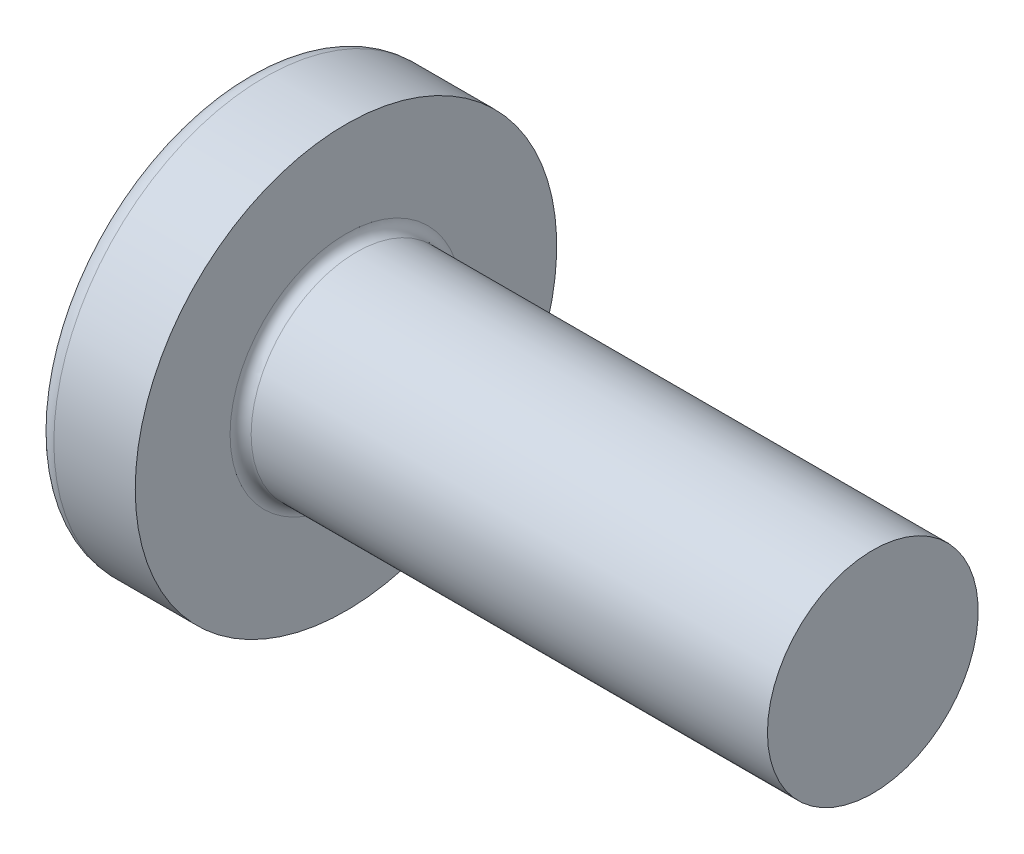
ISO-10303-21;
HEADER;
FILE_DESCRIPTION(('STEP AP214'),'2;1');
FILE_NAME('part.step','',(''),(''),'','','');
FILE_SCHEMA(('AUTOMOTIVE_DESIGN { 1 0 10303 214 1 1 1 1 }'));
ENDSEC;
DATA;
#1=APPLICATION_CONTEXT('core data for automotive mechanical design processes');
#2=APPLICATION_PROTOCOL_DEFINITION('international standard','automotive_design',2000,#1);
#3=PRODUCT_CONTEXT('',#1,'mechanical');
#4=PRODUCT('Part','Part','',(#3));
#5=PRODUCT_RELATED_PRODUCT_CATEGORY('part','',(#4));
#6=PRODUCT_DEFINITION_FORMATION('','',#4);
#7=PRODUCT_DEFINITION_CONTEXT('part definition',#1,'design');
#8=PRODUCT_DEFINITION('design','',#6,#7);
#9=PRODUCT_DEFINITION_SHAPE('','',#8);
#10=(LENGTH_UNIT() NAMED_UNIT(*) SI_UNIT(.MILLI.,.METRE.));
#11=(NAMED_UNIT(*) PLANE_ANGLE_UNIT() SI_UNIT($,.RADIAN.));
#12=(NAMED_UNIT(*) SI_UNIT($,.STERADIAN.) SOLID_ANGLE_UNIT());
#13=UNCERTAINTY_MEASURE_WITH_UNIT(LENGTH_MEASURE(1.E-05),#10,'distance_accuracy_value','');
#14=(GEOMETRIC_REPRESENTATION_CONTEXT(3) GLOBAL_UNCERTAINTY_ASSIGNED_CONTEXT((#13)) GLOBAL_UNIT_ASSIGNED_CONTEXT((#10,
#11,#12)) REPRESENTATION_CONTEXT('',''));
#15=CARTESIAN_POINT('',(0.,0.,0.));
#16=DIRECTION('',(0.,0.,1.));
#17=DIRECTION('',(1.,0.,0.));
#18=AXIS2_PLACEMENT_3D('',#15,#16,#17);
#19=CARTESIAN_POINT('',(6.5,0.,0.));
#20=DIRECTION('',(-1.,0.,0.));
#21=DIRECTION('',(0.,1.,0.));
#22=AXIS2_PLACEMENT_3D('',#19,#20,#21);
#23=SPHERICAL_SURFACE('',#22,6.5);
#24=CARTESIAN_POINT('',(1.26538895452803,0.,0.));
#25=DIRECTION('',(-1.,0.,0.));
#26=DIRECTION('',(0.,0.,1.));
#27=AXIS2_PLACEMENT_3D('',#24,#25,#26);
#28=CIRCLE('',#27,3.85342019543974);
#29=CARTESIAN_POINT('',(1.26538895452803,0.,3.85342019543974));
#30=VERTEX_POINT('',#29);
#31=EDGE_CURVE('E218',#30,#30,#28,.T.);
#32=ORIENTED_EDGE('',*,*,#31,.T.);
#33=EDGE_LOOP('',(#32));
#34=FACE_BOUND('',#33,.T.);
#35=CARTESIAN_POINT('',(0.0788099820016241,0.,0.));
#36=DIRECTION('',(1.,0.,0.));
#37=DIRECTION('',(0.,0.,-1.));
#38=AXIS2_PLACEMENT_3D('',#35,#36,#37);
#39=CIRCLE('',#38,1.0091178091571);
#40=CARTESIAN_POINT('',(0.0788099820016244,-0.514999999999996,-0.867809744562728));
#41=VERTEX_POINT('',#40);
#42=CARTESIAN_POINT('',(0.0788099820016241,-0.867809744562729,-0.515));
#43=VERTEX_POINT('',#42);
#44=EDGE_CURVE('E345',#41,#43,#39,.F.);
#45=ORIENTED_EDGE('',*,*,#44,.F.);
#46=CARTESIAN_POINT('',(6.5,-0.515000000000001,0.));
#47=DIRECTION('',(0.,1.,0.));
#48=DIRECTION('',(0.,0.,1.));
#49=AXIS2_PLACEMENT_3D('',#46,#47,#48);
#50=CIRCLE('',#49,6.47956595768575);
#51=CARTESIAN_POINT('',(0.331830520157854,-0.514999999999992,-1.98455543332603));
#52=VERTEX_POINT('',#51);
#53=EDGE_CURVE('E278',#52,#41,#50,.T.);
#54=ORIENTED_EDGE('',*,*,#53,.F.);
#55=CARTESIAN_POINT('',(6.06443225879603,0.,0.873613881878153));
#56=DIRECTION('',(0.446197753347436,0.,-0.894934391398443));
#57=DIRECTION('',(-0.894934391398442,0.,-0.446197753347436));
#58=AXIS2_PLACEMENT_3D('',#55,#56,#57);
#59=CIRCLE('',#58,6.42628038045433);
#60=CARTESIAN_POINT('',(0.331830520157856,0.515000000000007,-1.98455543332603));
#61=VERTEX_POINT('',#60);
#62=EDGE_CURVE('E252',#52,#61,#59,.T.);
#63=ORIENTED_EDGE('',*,*,#62,.T.);
#64=CARTESIAN_POINT('',(6.5,0.515,0.));
#65=DIRECTION('',(0.,-1.,0.));
#66=DIRECTION('',(0.,0.,-1.));
#67=AXIS2_PLACEMENT_3D('',#64,#65,#66);
#68=CIRCLE('',#67,6.47956595768574);
#69=CARTESIAN_POINT('',(0.0788099820016249,0.515000000000003,-0.867809744562724));
#70=VERTEX_POINT('',#69);
#71=EDGE_CURVE('E307',#70,#61,#68,.T.);
#72=ORIENTED_EDGE('',*,*,#71,.F.);
#73=CARTESIAN_POINT('',(0.0788099820016241,0.867809744562719,-0.515));
#74=VERTEX_POINT('',#73);
#75=EDGE_CURVE('E360',#74,#70,#39,.F.);
#76=ORIENTED_EDGE('',*,*,#75,.F.);
#77=CARTESIAN_POINT('',(6.5,0.,-0.515));
#78=DIRECTION('',(0.,0.,1.));
#79=DIRECTION('',(1.,0.,0.));
#80=AXIS2_PLACEMENT_3D('',#77,#78,#79);
#81=CIRCLE('',#80,6.47956595768574);
#82=CARTESIAN_POINT('',(0.331830520157856,1.98455543332603,-0.515));
#83=VERTEX_POINT('',#82);
#84=EDGE_CURVE('E246',#83,#74,#81,.T.);
#85=ORIENTED_EDGE('',*,*,#84,.F.);
#86=CARTESIAN_POINT('',(6.06443225879604,-0.873613881878154,0.));
#87=DIRECTION('',(0.446197753347436,0.894934391398443,0.));
#88=DIRECTION('',(-0.894934391398442,0.446197753347436,0.));
#89=AXIS2_PLACEMENT_3D('',#86,#87,#88);
#90=CIRCLE('',#89,6.42628038045433);
#91=CARTESIAN_POINT('',(0.331830520157857,1.98455543332603,0.515));
#92=VERTEX_POINT('',#91);
#93=EDGE_CURVE('E249',#83,#92,#90,.T.);
#94=ORIENTED_EDGE('',*,*,#93,.T.);
#95=CARTESIAN_POINT('',(6.5,0.,0.515000000000001));
#96=DIRECTION('',(0.,0.,-1.));
#97=DIRECTION('',(-1.,0.,0.));
#98=AXIS2_PLACEMENT_3D('',#95,#96,#97);
#99=CIRCLE('',#98,6.47956595768574);
#100=CARTESIAN_POINT('',(0.0788099820016241,0.867809744562719,0.514999999999999));
#101=VERTEX_POINT('',#100);
#102=EDGE_CURVE('E242',#101,#92,#99,.T.);
#103=ORIENTED_EDGE('',*,*,#102,.F.);
#104=CARTESIAN_POINT('',(0.0788099820016253,0.514999999999997,0.867809744562727));
#105=VERTEX_POINT('',#104);
#106=EDGE_CURVE('E359',#105,#101,#39,.F.);
#107=ORIENTED_EDGE('',*,*,#106,.F.);
#108=CARTESIAN_POINT('',(0.331830520157856,0.514999999999993,1.98455543332603));
#109=VERTEX_POINT('',#108);
#110=EDGE_CURVE('E262',#109,#105,#68,.T.);
#111=ORIENTED_EDGE('',*,*,#110,.F.);
#112=CARTESIAN_POINT('',(6.06443225879603,0.,-0.873613881878153));
#113=DIRECTION('',(0.446197753347436,0.,0.894934391398443));
#114=DIRECTION('',(0.894934391398442,0.,-0.446197753347436));
#115=AXIS2_PLACEMENT_3D('',#112,#113,#114);
#116=CIRCLE('',#115,6.42628038045433);
#117=CARTESIAN_POINT('',(0.331830520157855,-0.515000000000007,1.98455543332603));
#118=VERTEX_POINT('',#117);
#119=EDGE_CURVE('E53',#109,#118,#116,.T.);
#120=ORIENTED_EDGE('',*,*,#119,.T.);
#121=CARTESIAN_POINT('',(0.0788099820016247,-0.515000000000003,0.867809744562724));
#122=VERTEX_POINT('',#121);
#123=EDGE_CURVE('E259',#122,#118,#50,.T.);
#124=ORIENTED_EDGE('',*,*,#123,.F.);
#125=CARTESIAN_POINT('',(0.0788099820016241,-0.867809744562729,0.514999999999999));
#126=VERTEX_POINT('',#125);
#127=EDGE_CURVE('E395',#126,#122,#39,.F.);
#128=ORIENTED_EDGE('',*,*,#127,.F.);
#129=CARTESIAN_POINT('',(0.331830520157853,-1.98455543332603,0.514999999999999));
#130=VERTEX_POINT('',#129);
#131=EDGE_CURVE('E243',#130,#126,#99,.T.);
#132=ORIENTED_EDGE('',*,*,#131,.F.);
#133=CARTESIAN_POINT('',(6.06443225879603,0.873613881878152,0.));
#134=DIRECTION('',(0.446197753347436,-0.894934391398443,0.));
#135=DIRECTION('',(0.894934391398442,0.446197753347436,0.));
#136=AXIS2_PLACEMENT_3D('',#133,#134,#135);
#137=CIRCLE('',#136,6.42628038045433);
#138=CARTESIAN_POINT('',(0.331830520157853,-1.98455543332603,-0.515));
#139=VERTEX_POINT('',#138);
#140=EDGE_CURVE('E239',#130,#139,#137,.T.);
#141=ORIENTED_EDGE('',*,*,#140,.T.);
#142=EDGE_CURVE('E68',#43,#139,#81,.T.);
#143=ORIENTED_EDGE('',*,*,#142,.F.);
#144=EDGE_LOOP('',(#45,#54,#63,#72,#76,#85,#94,#103,#107,#111,#120,#124,#128,#132,#141,#143));
#145=FACE_BOUND('',#144,.T.);
#146=ADVANCED_FACE('F39',(#34,#145),#23,.T.);
#147=CARTESIAN_POINT('',(0.,2.15,-0.515));
#148=DIRECTION('',(0.,0.,1.));
#149=DIRECTION('',(1.,0.,0.));
#150=AXIS2_PLACEMENT_3D('',#147,#148,#149);
#151=PLANE('',#150);
#152=ORIENTED_EDGE('',*,*,#84,.T.);
#153=CARTESIAN_POINT('',(-1.51195208675156,0.994972220320188,-0.515));
#154=CARTESIAN_POINT('',(-1.20405981949279,0.970722016949958,-0.515));
#155=CARTESIAN_POINT('',(-0.896180907521174,0.946299109919651,-0.515));
#156=CARTESIAN_POINT('',(-0.280449079832185,0.896981122427851,-0.515));
#157=CARTESIAN_POINT('',(0.0274038344396872,0.872086023934883,-0.515));
#158=CARTESIAN_POINT('',(0.489146739515351,0.83429553519528,-0.515));
#159=CARTESIAN_POINT('',(0.643055047553846,0.821624058404092,-0.515));
#160=CARTESIAN_POINT('',(0.950856520197141,0.796108332639504,-0.515));
#161=CARTESIAN_POINT('',(1.10474968487868,0.783264084592466,-0.515));
#162=CARTESIAN_POINT('',(1.41251352095103,0.757376569093378,-0.515));
#163=CARTESIAN_POINT('',(1.56638419296577,0.744333309065218,-0.515));
#164=CARTESIAN_POINT('',(1.87410847343335,0.718013273188896,-0.515));
#165=CARTESIAN_POINT('',(2.02796208151372,0.704736492982792,-0.515));
#166=CARTESIAN_POINT('',(2.36455311890989,0.675386943006726,-0.515));
#167=CARTESIAN_POINT('',(2.54728562293342,0.659257575640986,-0.515));
#168=CARTESIAN_POINT('',(2.91270624109256,0.626517182479888,-0.515));
#169=CARTESIAN_POINT('',(3.09539435554038,0.609906160177238,-0.515));
#170=CARTESIAN_POINT('',(3.46069832191612,0.576073027116421,-0.515));
#171=CARTESIAN_POINT('',(3.64331417870068,0.558850968932727,-0.515));
#172=CARTESIAN_POINT('',(4.00847437496567,0.523604864540037,-0.515));
#173=CARTESIAN_POINT('',(4.19101871216888,0.505580794604253,-0.515));
#174=CARTESIAN_POINT('',(4.55606208157937,0.468429191666488,-0.515));
#175=CARTESIAN_POINT('',(4.73856107358022,0.449301262281853,-0.515));
#176=CARTESIAN_POINT('',(5.10337547353418,0.409473604748924,-0.515));
#177=CARTESIAN_POINT('',(5.28569089526422,0.38877400510607,-0.515));
#178=CARTESIAN_POINT('',(5.55897278495411,0.355828287527264,-0.515));
#179=CARTESIAN_POINT('',(5.65005277419685,0.344527918782738,-0.515));
#180=CARTESIAN_POINT('',(5.83209904103607,0.321075174263031,-0.515));
#181=CARTESIAN_POINT('',(5.92306532397915,0.308922840209686,-0.515));
#182=CARTESIAN_POINT('',(6.10486078872898,0.28342733445193,-0.515));
#183=CARTESIAN_POINT('',(6.19568992299379,0.270083817601714,-0.515));
#184=CARTESIAN_POINT('',(6.33172773785679,0.248701420809951,-0.515));
#185=CARTESIAN_POINT('',(6.37704304473344,0.241345446705304,-0.515));
#186=CARTESIAN_POINT('',(6.4675722520141,0.226018953559338,-0.515));
#187=CARTESIAN_POINT('',(6.51278614568082,0.218048394864476,-0.515));
#188=CARTESIAN_POINT('',(6.55793125759548,0.209691465274945,-0.515));
#189=B_SPLINE_CURVE_WITH_KNOTS('',3,(#153,#154,#155,#156,#157,#158,#159,#160,#161,#162,#163,
#164,#165,#166,#167,#168,#169,#170,#171,#172,#173,#174,#175,#176,#177,#178,#179,#180,#181,#182,
#183,#184,#185,#186,#187,#188),.UNSPECIFIED.,.F.,.F.,(4,2,2,2,2,2,2,2,2,2,2,2,2,2,2,2,2,4),(0.,
0.926537709781721,1.85311087258339,2.31639796016285,2.77968256468771,3.24294992902054,
3.70622594801777,4.25655436065378,4.80687878359543,5.35715597005738,5.90744944680718,
6.45794177197673,7.00838913527399,7.28372117336898,7.5590397375059,7.83443833587748,
7.97216007460854,8.10989070671571),.UNSPECIFIED.);
#190=CARTESIAN_POINT('',(2.34,0.677477674908923,-0.515));
#191=VERTEX_POINT('',#190);
#192=EDGE_CURVE('E382',#74,#191,#189,.T.);
#193=ORIENTED_EDGE('',*,*,#192,.T.);
#194=DIRECTION('',(0.,1.,0.));
#195=VECTOR('',#194,1.);
#196=CARTESIAN_POINT('',(2.34,-0.983319232260742,-0.515));
#197=LINE('',#196,#195);
#198=CARTESIAN_POINT('',(2.34,0.983319232260743,-0.515));
#199=VERTEX_POINT('',#198);
#200=EDGE_CURVE('E328',#191,#199,#197,.T.);
#201=ORIENTED_EDGE('',*,*,#200,.T.);
#202=DIRECTION('',(0.894934391398442,-0.446197753347436,0.));
#203=VECTOR('',#202,1.);
#204=CARTESIAN_POINT('',(0.,2.15,-0.515));
#205=LINE('',#204,#203);
#206=EDGE_CURVE('E219',#83,#199,#205,.T.);
#207=ORIENTED_EDGE('',*,*,#206,.F.);
#208=EDGE_LOOP('',(#152,#193,#201,#207));
#209=FACE_BOUND('',#208,.T.);
#210=ADVANCED_FACE('F174',(#209),#151,.T.);
#211=CARTESIAN_POINT('',(2.34,-0.983319232260742,-0.515));
#212=VERTEX_POINT('',#211);
#213=CARTESIAN_POINT('',(2.34,-0.677477674908923,-0.515));
#214=VERTEX_POINT('',#213);
#215=EDGE_CURVE('E227',#212,#214,#197,.T.);
#216=ORIENTED_EDGE('',*,*,#215,.T.);
#217=CARTESIAN_POINT('',(-1.51195208675156,-0.994972220320188,-0.515));
#218=CARTESIAN_POINT('',(-1.20405981949279,-0.970722016949958,-0.515));
#219=CARTESIAN_POINT('',(-0.896180907521174,-0.946299109919651,-0.515));
#220=CARTESIAN_POINT('',(-0.280449079832185,-0.896981122427851,-0.515));
#221=CARTESIAN_POINT('',(0.027403834439687,-0.872086023934883,-0.515));
#222=CARTESIAN_POINT('',(0.48914673951535,-0.83429553519528,-0.515));
#223=CARTESIAN_POINT('',(0.643055047553845,-0.821624058404092,-0.515));
#224=CARTESIAN_POINT('',(0.95085652019714,-0.796108332639504,-0.515));
#225=CARTESIAN_POINT('',(1.10474968487868,-0.783264084592466,-0.515));
#226=CARTESIAN_POINT('',(1.41251352095103,-0.757376569093378,-0.515));
#227=CARTESIAN_POINT('',(1.56638419296577,-0.744333309065218,-0.515));
#228=CARTESIAN_POINT('',(1.87410847343335,-0.718013273188896,-0.515));
#229=CARTESIAN_POINT('',(2.02796208151372,-0.704736492982792,-0.515));
#230=CARTESIAN_POINT('',(2.36455311890989,-0.675386943006726,-0.515));
#231=CARTESIAN_POINT('',(2.54728562293342,-0.659257575640986,-0.515));
#232=CARTESIAN_POINT('',(2.91270624109256,-0.626517182479888,-0.515));
#233=CARTESIAN_POINT('',(3.09539435554038,-0.609906160177238,-0.515));
#234=CARTESIAN_POINT('',(3.46069832191613,-0.576073027116421,-0.515));
#235=CARTESIAN_POINT('',(3.64331417870068,-0.558850968932727,-0.515));
#236=CARTESIAN_POINT('',(4.00847437496567,-0.523604864540037,-0.515));
#237=CARTESIAN_POINT('',(4.19101871216888,-0.505580794604252,-0.515));
#238=CARTESIAN_POINT('',(4.55606208157937,-0.468429191666487,-0.515));
#239=CARTESIAN_POINT('',(4.73856107358023,-0.449301262281853,-0.515));
#240=CARTESIAN_POINT('',(5.10337547353419,-0.409473604748924,-0.515));
#241=CARTESIAN_POINT('',(5.28569089526422,-0.388774005106069,-0.515));
#242=CARTESIAN_POINT('',(5.55897278495412,-0.355828287527264,-0.515));
#243=CARTESIAN_POINT('',(5.65005277419686,-0.344527918782738,-0.515));
#244=CARTESIAN_POINT('',(5.83209904103608,-0.32107517426303,-0.515));
#245=CARTESIAN_POINT('',(5.92306532397915,-0.308922840209685,-0.515));
#246=CARTESIAN_POINT('',(6.10486078872898,-0.283427334451929,-0.515));
#247=CARTESIAN_POINT('',(6.1956899229938,-0.270083817601713,-0.515));
#248=CARTESIAN_POINT('',(6.33172773785679,-0.24870142080995,-0.515));
#249=CARTESIAN_POINT('',(6.37704304473344,-0.241345446705303,-0.515));
#250=CARTESIAN_POINT('',(6.4675722520141,-0.226018953559337,-0.515));
#251=CARTESIAN_POINT('',(6.51278614568083,-0.218048394864475,-0.515));
#252=CARTESIAN_POINT('',(6.55793125759549,-0.209691465274944,-0.515));
#253=B_SPLINE_CURVE_WITH_KNOTS('',3,(#217,#218,#219,#220,#221,#222,#223,#224,#225,#226,#227,
#228,#229,#230,#231,#232,#233,#234,#235,#236,#237,#238,#239,#240,#241,#242,#243,#244,#245,#246,
#247,#248,#249,#250,#251,#252),.UNSPECIFIED.,.F.,.F.,(4,2,2,2,2,2,2,2,2,2,2,2,2,2,2,2,2,4),(0.,
0.926537709781721,1.85311087258339,2.31639796016285,2.77968256468771,3.24294992902054,
3.70622594801777,4.25655436065378,4.80687878359543,5.35715597005738,5.90744944680718,
6.45794177197673,7.008389135274,7.28372117336899,7.55903973750591,7.83443833587749,
7.97216007460855,8.10989070671571),.UNSPECIFIED.);
#254=EDGE_CURVE('E358',#214,#43,#253,.F.);
#255=ORIENTED_EDGE('',*,*,#254,.T.);
#256=ORIENTED_EDGE('',*,*,#142,.T.);
#257=DIRECTION('',(0.894934391398442,0.446197753347436,0.));
#258=VECTOR('',#257,1.);
#259=CARTESIAN_POINT('',(0.,-2.15,-0.515));
#260=LINE('',#259,#258);
#261=EDGE_CURVE('E310',#139,#212,#260,.T.);
#262=ORIENTED_EDGE('',*,*,#261,.T.);
#263=EDGE_LOOP('',(#216,#255,#256,#262));
#264=FACE_BOUND('',#263,.T.);
#265=ADVANCED_FACE('F180',(#264),#151,.T.);
#266=CARTESIAN_POINT('',(0.,-2.15,0.514999999999999));
#267=DIRECTION('',(0.,0.,-1.));
#268=DIRECTION('',(-1.,0.,0.));
#269=AXIS2_PLACEMENT_3D('',#266,#267,#268);
#270=PLANE('',#269);
#271=DIRECTION('',(0.,-1.,0.));
#272=VECTOR('',#271,1.);
#273=CARTESIAN_POINT('',(2.34,0.983319232260742,0.515));
#274=LINE('',#273,#272);
#275=CARTESIAN_POINT('',(2.34,0.983319232260743,0.515));
#276=VERTEX_POINT('',#275);
#277=CARTESIAN_POINT('',(2.34,0.677477674908923,0.515));
#278=VERTEX_POINT('',#277);
#279=EDGE_CURVE('E318',#276,#278,#274,.T.);
#280=ORIENTED_EDGE('',*,*,#279,.T.);
#281=CARTESIAN_POINT('',(-1.51195208675156,0.994972220320188,0.514999999999999));
#282=CARTESIAN_POINT('',(-1.20405981949279,0.970722016949958,0.514999999999999));
#283=CARTESIAN_POINT('',(-0.896180907521173,0.946299109919651,0.514999999999999));
#284=CARTESIAN_POINT('',(-0.280449079832185,0.896981122427852,0.514999999999999));
#285=CARTESIAN_POINT('',(0.0274038344396875,0.872086023934883,0.514999999999999));
#286=CARTESIAN_POINT('',(0.489146739515351,0.83429553519528,0.515));
#287=CARTESIAN_POINT('',(0.643055047553846,0.821624058404092,0.515));
#288=CARTESIAN_POINT('',(0.950856520197141,0.796108332639504,0.515));
#289=CARTESIAN_POINT('',(1.10474968487868,0.783264084592466,0.515));
#290=CARTESIAN_POINT('',(1.41251352095103,0.757376569093378,0.515));
#291=CARTESIAN_POINT('',(1.56638419296577,0.744333309065218,0.515));
#292=CARTESIAN_POINT('',(1.87410847343335,0.718013273188896,0.515));
#293=CARTESIAN_POINT('',(2.02796208151372,0.704736492982792,0.515));
#294=CARTESIAN_POINT('',(2.36455311890989,0.675386943006726,0.515));
#295=CARTESIAN_POINT('',(2.54728562293342,0.659257575640986,0.515));
#296=CARTESIAN_POINT('',(2.91270624109256,0.626517182479888,0.515));
#297=CARTESIAN_POINT('',(3.09539435554038,0.609906160177238,0.515));
#298=CARTESIAN_POINT('',(3.46069832191613,0.576073027116421,0.515));
#299=CARTESIAN_POINT('',(3.64331417870068,0.558850968932727,0.515));
#300=CARTESIAN_POINT('',(4.00847437496567,0.523604864540037,0.515));
#301=CARTESIAN_POINT('',(4.19101871216888,0.505580794604252,0.515));
#302=CARTESIAN_POINT('',(4.55606208157937,0.468429191666487,0.515));
#303=CARTESIAN_POINT('',(4.73856107358023,0.449301262281853,0.515000000000001));
#304=CARTESIAN_POINT('',(5.10337547353419,0.409473604748923,0.515000000000001));
#305=CARTESIAN_POINT('',(5.28569089526422,0.388774005106068,0.515000000000001));
#306=CARTESIAN_POINT('',(5.55897278495412,0.355828287527263,0.515000000000001));
#307=CARTESIAN_POINT('',(5.65005277419686,0.344527918782737,0.515000000000001));
#308=CARTESIAN_POINT('',(5.83209904103608,0.32107517426303,0.515000000000001));
#309=CARTESIAN_POINT('',(5.92306532397915,0.308922840209685,0.515000000000001));
#310=CARTESIAN_POINT('',(6.10486078872898,0.283427334451929,0.515000000000001));
#311=CARTESIAN_POINT('',(6.1956899229938,0.270083817601713,0.515000000000001));
#312=CARTESIAN_POINT('',(6.33172773785679,0.248701420809949,0.515000000000001));
#313=CARTESIAN_POINT('',(6.37704304473344,0.241345446705302,0.515000000000001));
#314=CARTESIAN_POINT('',(6.4675722520141,0.226018953559336,0.515000000000001));
#315=CARTESIAN_POINT('',(6.51278614568083,0.218048394864474,0.515000000000001));
#316=CARTESIAN_POINT('',(6.55793125759549,0.209691465274942,0.515000000000001));
#317=B_SPLINE_CURVE_WITH_KNOTS('',3,(#281,#282,#283,#284,#285,#286,#287,#288,#289,#290,#291,
#292,#293,#294,#295,#296,#297,#298,#299,#300,#301,#302,#303,#304,#305,#306,#307,#308,#309,#310,
#311,#312,#313,#314,#315,#316),.UNSPECIFIED.,.F.,.F.,(4,2,2,2,2,2,2,2,2,2,2,2,2,2,2,2,2,4),(0.,
0.926537709781721,1.85311087258339,2.31639796016285,2.77968256468771,3.24294992902054,
3.70622594801777,4.25655436065378,4.80687878359543,5.35715597005738,5.90744944680718,
6.45794177197673,7.008389135274,7.28372117336899,7.55903973750591,7.83443833587749,
7.97216007460855,8.10989070671571),.UNSPECIFIED.);
#318=EDGE_CURVE('E283',#278,#101,#317,.F.);
#319=ORIENTED_EDGE('',*,*,#318,.T.);
#320=ORIENTED_EDGE('',*,*,#102,.T.);
#321=DIRECTION('',(0.894934391398442,-0.446197753347436,0.));
#322=VECTOR('',#321,1.);
#323=CARTESIAN_POINT('',(0.,2.15,0.515));
#324=LINE('',#323,#322);
#325=EDGE_CURVE('E224',#92,#276,#324,.T.);
#326=ORIENTED_EDGE('',*,*,#325,.T.);
#327=EDGE_LOOP('',(#280,#319,#320,#326));
#328=FACE_BOUND('',#327,.T.);
#329=ADVANCED_FACE('F378',(#328),#270,.T.);
#330=ORIENTED_EDGE('',*,*,#131,.T.);
#331=CARTESIAN_POINT('',(-1.51195208675156,-0.994972220320188,0.514999999999999));
#332=CARTESIAN_POINT('',(-1.20405981949279,-0.970722016949958,0.514999999999999));
#333=CARTESIAN_POINT('',(-0.896180907521174,-0.946299109919651,0.514999999999999));
#334=CARTESIAN_POINT('',(-0.280449079832185,-0.896981122427852,0.514999999999999));
#335=CARTESIAN_POINT('',(0.0274038344396874,-0.872086023934883,0.514999999999999));
#336=CARTESIAN_POINT('',(0.489146739515351,-0.83429553519528,0.514999999999999));
#337=CARTESIAN_POINT('',(0.643055047553846,-0.821624058404092,0.514999999999999));
#338=CARTESIAN_POINT('',(0.950856520197141,-0.796108332639504,0.514999999999999));
#339=CARTESIAN_POINT('',(1.10474968487868,-0.783264084592466,0.515));
#340=CARTESIAN_POINT('',(1.41251352095103,-0.757376569093379,0.515));
#341=CARTESIAN_POINT('',(1.56638419296577,-0.744333309065218,0.515));
#342=CARTESIAN_POINT('',(1.87410847343335,-0.718013273188896,0.515));
#343=CARTESIAN_POINT('',(2.02796208151372,-0.704736492982792,0.515));
#344=CARTESIAN_POINT('',(2.36455311890989,-0.675386943006726,0.515));
#345=CARTESIAN_POINT('',(2.54728562293342,-0.659257575640986,0.515));
#346=CARTESIAN_POINT('',(2.91270624109256,-0.626517182479888,0.515));
#347=CARTESIAN_POINT('',(3.09539435554038,-0.609906160177238,0.515));
#348=CARTESIAN_POINT('',(3.46069832191613,-0.576073027116421,0.515));
#349=CARTESIAN_POINT('',(3.64331417870068,-0.558850968932727,0.515));
#350=CARTESIAN_POINT('',(4.00847437496567,-0.523604864540037,0.515));
#351=CARTESIAN_POINT('',(4.19101871216888,-0.505580794604253,0.515));
#352=CARTESIAN_POINT('',(4.55606208157937,-0.468429191666487,0.515));
#353=CARTESIAN_POINT('',(4.73856107358022,-0.449301262281853,0.515));
#354=CARTESIAN_POINT('',(5.10337547353418,-0.409473604748924,0.515));
#355=CARTESIAN_POINT('',(5.28569089526422,-0.388774005106069,0.515));
#356=CARTESIAN_POINT('',(5.55897278495412,-0.355828287527263,0.515000000000001));
#357=CARTESIAN_POINT('',(5.65005277419686,-0.344527918782738,0.515000000000001));
#358=CARTESIAN_POINT('',(5.83209904103607,-0.32107517426303,0.515000000000001));
#359=CARTESIAN_POINT('',(5.92306532397915,-0.308922840209685,0.515000000000001));
#360=CARTESIAN_POINT('',(6.10486078872898,-0.283427334451929,0.515000000000001));
#361=CARTESIAN_POINT('',(6.19568992299379,-0.270083817601713,0.515000000000001));
#362=CARTESIAN_POINT('',(6.33172773785679,-0.24870142080995,0.515000000000001));
#363=CARTESIAN_POINT('',(6.37704304473344,-0.241345446705303,0.515000000000001));
#364=CARTESIAN_POINT('',(6.4675722520141,-0.226018953559336,0.515000000000001));
#365=CARTESIAN_POINT('',(6.51278614568083,-0.218048394864474,0.515000000000001));
#366=CARTESIAN_POINT('',(6.55793125759549,-0.209691465274943,0.515000000000001));
#367=B_SPLINE_CURVE_WITH_KNOTS('',3,(#331,#332,#333,#334,#335,#336,#337,#338,#339,#340,#341,
#342,#343,#344,#345,#346,#347,#348,#349,#350,#351,#352,#353,#354,#355,#356,#357,#358,#359,#360,
#361,#362,#363,#364,#365,#366),.UNSPECIFIED.,.F.,.F.,(4,2,2,2,2,2,2,2,2,2,2,2,2,2,2,2,2,4),(0.,
0.926537709781721,1.85311087258339,2.31639796016285,2.77968256468771,3.24294992902055,
3.70622594801777,4.25655436065378,4.80687878359543,5.35715597005738,5.90744944680718,
6.45794177197673,7.008389135274,7.28372117336899,7.55903973750591,7.83443833587748,
7.97216007460854,8.10989070671571),.UNSPECIFIED.);
#368=CARTESIAN_POINT('',(2.34,-0.677477674908923,0.515));
#369=VERTEX_POINT('',#368);
#370=EDGE_CURVE('E396',#126,#369,#367,.T.);
#371=ORIENTED_EDGE('',*,*,#370,.T.);
#372=CARTESIAN_POINT('',(2.34,-0.983319232260743,0.515));
#373=VERTEX_POINT('',#372);
#374=EDGE_CURVE('E320',#369,#373,#274,.T.);
#375=ORIENTED_EDGE('',*,*,#374,.T.);
#376=DIRECTION('',(0.894934391398443,0.446197753347436,0.));
#377=VECTOR('',#376,1.);
#378=CARTESIAN_POINT('',(0.,-2.15,0.514999999999999));
#379=LINE('',#378,#377);
#380=EDGE_CURVE('E312',#130,#373,#379,.T.);
#381=ORIENTED_EDGE('',*,*,#380,.F.);
#382=EDGE_LOOP('',(#330,#371,#375,#381));
#383=FACE_BOUND('',#382,.T.);
#384=ADVANCED_FACE('F424',(#383),#270,.T.);
#385=CARTESIAN_POINT('',(2.34,0.983319232260742,-0.515));
#386=DIRECTION('',(-1.,0.,0.));
#387=DIRECTION('',(0.,0.,1.));
#388=AXIS2_PLACEMENT_3D('',#385,#386,#387);
#389=PLANE('',#388);
#390=ORIENTED_EDGE('',*,*,#374,.F.);
#391=CARTESIAN_POINT('',(2.34,0.,0.));
#392=DIRECTION('',(-1.,0.,0.));
#393=DIRECTION('',(0.,0.,1.));
#394=AXIS2_PLACEMENT_3D('',#391,#392,#393);
#395=CIRCLE('',#394,0.851);
#396=EDGE_CURVE('E353',#214,#369,#395,.T.);
#397=ORIENTED_EDGE('',*,*,#396,.F.);
#398=ORIENTED_EDGE('',*,*,#215,.F.);
#399=DIRECTION('',(0.,0.,1.));
#400=VECTOR('',#399,1.);
#401=CARTESIAN_POINT('',(2.34,-0.983319232260742,-0.515));
#402=LINE('',#401,#400);
#403=EDGE_CURVE('E315',#212,#373,#402,.T.);
#404=ORIENTED_EDGE('',*,*,#403,.T.);
#405=EDGE_LOOP('',(#390,#397,#398,#404));
#406=FACE_BOUND('',#405,.T.);
#407=ADVANCED_FACE('F422',(#406),#389,.T.);
#408=DIRECTION('',(0.,0.,-1.));
#409=VECTOR('',#408,1.);
#410=CARTESIAN_POINT('',(2.34,-0.515000000000004,0.983319232260741));
#411=LINE('',#410,#409);
#412=CARTESIAN_POINT('',(2.34,-0.514999999999997,-0.677477674908925));
#413=VERTEX_POINT('',#412);
#414=CARTESIAN_POINT('',(2.34,-0.514999999999996,-0.983319232260744));
#415=VERTEX_POINT('',#414);
#416=EDGE_CURVE('E301',#413,#415,#411,.T.);
#417=ORIENTED_EDGE('',*,*,#416,.F.);
#418=CARTESIAN_POINT('',(2.34,0.515000000000003,-0.677477674908921));
#419=VERTEX_POINT('',#418);
#420=EDGE_CURVE('E60',#419,#413,#395,.T.);
#421=ORIENTED_EDGE('',*,*,#420,.F.);
#422=DIRECTION('',(0.,0.,1.));
#423=VECTOR('',#422,1.);
#424=CARTESIAN_POINT('',(2.34,0.515000000000004,-0.983319232260741));
#425=LINE('',#424,#423);
#426=CARTESIAN_POINT('',(2.34,0.515000000000004,-0.983319232260741));
#427=VERTEX_POINT('',#426);
#428=EDGE_CURVE('E304',#427,#419,#425,.T.);
#429=ORIENTED_EDGE('',*,*,#428,.F.);
#430=DIRECTION('',(0.,-1.,0.));
#431=VECTOR('',#430,1.);
#432=CARTESIAN_POINT('',(2.34,0.515000000000004,-0.983319232260741));
#433=LINE('',#432,#431);
#434=EDGE_CURVE('E295',#427,#415,#433,.T.);
#435=ORIENTED_EDGE('',*,*,#434,.T.);
#436=EDGE_LOOP('',(#417,#421,#429,#435));
#437=FACE_BOUND('',#436,.T.);
#438=ADVANCED_FACE('F348',(#437),#389,.T.);
#439=ORIENTED_EDGE('',*,*,#200,.F.);
#440=EDGE_CURVE('E352',#278,#191,#395,.T.);
#441=ORIENTED_EDGE('',*,*,#440,.F.);
#442=ORIENTED_EDGE('',*,*,#279,.F.);
#443=DIRECTION('',(0.,0.,-1.));
#444=VECTOR('',#443,1.);
#445=CARTESIAN_POINT('',(2.34,0.983319232260742,0.515));
#446=LINE('',#445,#444);
#447=EDGE_CURVE('E321',#276,#199,#446,.T.);
#448=ORIENTED_EDGE('',*,*,#447,.T.);
#449=EDGE_LOOP('',(#439,#441,#442,#448));
#450=FACE_BOUND('',#449,.T.);
#451=ADVANCED_FACE('F431',(#450),#389,.T.);
#452=CARTESIAN_POINT('',(2.34,0.514999999999998,0.677477674908924));
#453=VERTEX_POINT('',#452);
#454=CARTESIAN_POINT('',(2.34,0.514999999999997,0.983319232260744));
#455=VERTEX_POINT('',#454);
#456=EDGE_CURVE('E276',#453,#455,#425,.T.);
#457=ORIENTED_EDGE('',*,*,#456,.F.);
#458=CARTESIAN_POINT('',(2.34,-0.515000000000003,0.677477674908921));
#459=VERTEX_POINT('',#458);
#460=EDGE_CURVE('E356',#459,#453,#395,.T.);
#461=ORIENTED_EDGE('',*,*,#460,.F.);
#462=CARTESIAN_POINT('',(2.34,-0.515000000000004,0.983319232260741));
#463=VERTEX_POINT('',#462);
#464=EDGE_CURVE('E298',#463,#459,#411,.T.);
#465=ORIENTED_EDGE('',*,*,#464,.F.);
#466=DIRECTION('',(0.,1.,0.));
#467=VECTOR('',#466,1.);
#468=CARTESIAN_POINT('',(2.34,-0.515000000000004,0.983319232260741));
#469=LINE('',#468,#467);
#470=EDGE_CURVE('E302',#463,#455,#469,.T.);
#471=ORIENTED_EDGE('',*,*,#470,.T.);
#472=EDGE_LOOP('',(#457,#461,#465,#471));
#473=FACE_BOUND('',#472,.T.);
#474=ADVANCED_FACE('F426',(#473),#389,.T.);
#475=CARTESIAN_POINT('',(0.,0.514999999999993,2.15));
#476=DIRECTION('',(0.,-1.,0.));
#477=DIRECTION('',(1.,0.,0.));
#478=AXIS2_PLACEMENT_3D('',#475,#476,#477);
#479=PLANE('',#478);
#480=ORIENTED_EDGE('',*,*,#110,.T.);
#481=CARTESIAN_POINT('',(-1.51195208675156,0.514999999999997,0.994972220320189));
#482=CARTESIAN_POINT('',(-1.20405981949279,0.514999999999997,0.97072201694996));
#483=CARTESIAN_POINT('',(-0.896180907521173,0.514999999999997,0.946299109919652));
#484=CARTESIAN_POINT('',(-0.280449079832184,0.514999999999997,0.896981122427853));
#485=CARTESIAN_POINT('',(0.0274038344396879,0.514999999999997,0.872086023934884));
#486=CARTESIAN_POINT('',(0.489146739515351,0.514999999999997,0.834295535195282));
#487=CARTESIAN_POINT('',(0.643055047553846,0.514999999999997,0.821624058404094));
#488=CARTESIAN_POINT('',(0.950856520197141,0.514999999999997,0.796108332639506));
#489=CARTESIAN_POINT('',(1.10474968487868,0.514999999999997,0.783264084592467));
#490=CARTESIAN_POINT('',(1.41251352095103,0.514999999999997,0.75737656909338));
#491=CARTESIAN_POINT('',(1.56638419296577,0.514999999999997,0.74433330906522));
#492=CARTESIAN_POINT('',(1.87410847343335,0.514999999999998,0.718013273188897));
#493=CARTESIAN_POINT('',(2.02796208151372,0.514999999999998,0.704736492982794));
#494=CARTESIAN_POINT('',(2.36455311890989,0.514999999999998,0.675386943006728));
#495=CARTESIAN_POINT('',(2.54728562293342,0.514999999999998,0.659257575640987));
#496=CARTESIAN_POINT('',(2.91270624109256,0.514999999999998,0.626517182479889));
#497=CARTESIAN_POINT('',(3.09539435554038,0.514999999999998,0.60990616017724));
#498=CARTESIAN_POINT('',(3.46069832191613,0.514999999999998,0.576073027116423));
#499=CARTESIAN_POINT('',(3.64331417870068,0.514999999999998,0.558850968932729));
#500=CARTESIAN_POINT('',(4.00847437496567,0.514999999999998,0.523604864540039));
#501=CARTESIAN_POINT('',(4.19101871216888,0.514999999999998,0.505580794604254));
#502=CARTESIAN_POINT('',(4.55606208157937,0.514999999999999,0.468429191666489));
#503=CARTESIAN_POINT('',(4.73856107358023,0.514999999999999,0.449301262281855));
#504=CARTESIAN_POINT('',(5.10337547353419,0.514999999999999,0.409473604748926));
#505=CARTESIAN_POINT('',(5.28569089526422,0.514999999999999,0.388774005106071));
#506=CARTESIAN_POINT('',(5.55897278495412,0.514999999999999,0.355828287527265));
#507=CARTESIAN_POINT('',(5.65005277419686,0.514999999999999,0.344527918782739));
#508=CARTESIAN_POINT('',(5.83209904103608,0.514999999999999,0.321075174263032));
#509=CARTESIAN_POINT('',(5.92306532397915,0.514999999999999,0.308922840209687));
#510=CARTESIAN_POINT('',(6.10486078872898,0.514999999999999,0.283427334451931));
#511=CARTESIAN_POINT('',(6.19568992299379,0.514999999999999,0.270083817601715));
#512=CARTESIAN_POINT('',(6.33172773785679,0.514999999999999,0.248701420809952));
#513=CARTESIAN_POINT('',(6.37704304473344,0.514999999999999,0.241345446705305));
#514=CARTESIAN_POINT('',(6.4675722520141,0.514999999999999,0.226018953559339));
#515=CARTESIAN_POINT('',(6.51278614568083,0.514999999999999,0.218048394864478));
#516=CARTESIAN_POINT('',(6.55793125759549,0.515,0.209691465274946));
#517=B_SPLINE_CURVE_WITH_KNOTS('',3,(#481,#482,#483,#484,#485,#486,#487,#488,#489,#490,#491,
#492,#493,#494,#495,#496,#497,#498,#499,#500,#501,#502,#503,#504,#505,#506,#507,#508,#509,#510,
#511,#512,#513,#514,#515,#516),.UNSPECIFIED.,.F.,.F.,(4,2,2,2,2,2,2,2,2,2,2,2,2,2,2,2,2,4),(0.,
0.926537709781721,1.85311087258339,2.31639796016285,2.77968256468771,3.24294992902054,
3.70622594801777,4.25655436065378,4.80687878359543,5.35715597005738,5.90744944680718,
6.45794177197673,7.008389135274,7.28372117336899,7.55903973750591,7.83443833587748,
7.97216007460854,8.10989070671571),.UNSPECIFIED.);
#518=EDGE_CURVE('E445',#105,#453,#517,.T.);
#519=ORIENTED_EDGE('',*,*,#518,.T.);
#520=ORIENTED_EDGE('',*,*,#456,.T.);
#521=DIRECTION('',(0.894934391398442,0.,-0.446197753347436));
#522=VECTOR('',#521,1.);
#523=CARTESIAN_POINT('',(0.,0.514999999999993,2.15));
#524=LINE('',#523,#522);
#525=EDGE_CURVE('E269',#109,#455,#524,.T.);
#526=ORIENTED_EDGE('',*,*,#525,.F.);
#527=EDGE_LOOP('',(#480,#519,#520,#526));
#528=FACE_BOUND('',#527,.T.);
#529=ADVANCED_FACE('F273',(#528),#479,.T.);
#530=CARTESIAN_POINT('',(0.,-0.514999999999992,-2.15));
#531=DIRECTION('',(0.,1.,0.));
#532=DIRECTION('',(-1.,0.,0.));
#533=AXIS2_PLACEMENT_3D('',#530,#531,#532);
#534=PLANE('',#533);
#535=ORIENTED_EDGE('',*,*,#464,.T.);
#536=CARTESIAN_POINT('',(-1.51195208754037,-0.515000000000003,0.994972220382296));
#537=CARTESIAN_POINT('',(-1.20405982018868,-0.515000000000003,0.970722017005062));
#538=CARTESIAN_POINT('',(-0.896180908124144,-0.515000000000003,0.946299109967687));
#539=CARTESIAN_POINT('',(-0.280449080249313,-0.515000000000003,0.896981122461526));
#540=CARTESIAN_POINT('',(0.027403834115485,-0.515000000000003,0.872086023961263));
#541=CARTESIAN_POINT('',(0.489146739371409,-0.515000000000003,0.834295535207135));
#542=CARTESIAN_POINT('',(0.643055047497245,-0.515000000000003,0.821624058408794));
#543=CARTESIAN_POINT('',(0.950856520315204,-0.515000000000003,0.796108332629704));
#544=CARTESIAN_POINT('',(1.10474968508407,-0.515000000000003,0.783264084575316));
#545=CARTESIAN_POINT('',(1.41251352133103,-0.515000000000003,0.757376569061286));
#546=CARTESIAN_POINT('',(1.56638419343305,-0.515000000000003,0.744333309025532));
#547=CARTESIAN_POINT('',(1.87410847407519,-0.515000000000003,0.718013273133714));
#548=CARTESIAN_POINT('',(2.02796208224283,-0.515000000000002,0.704736492919708));
#549=CARTESIAN_POINT('',(2.36455311972626,-0.515000000000002,0.675386942934954));
#550=CARTESIAN_POINT('',(2.5472856237498,-0.515000000000002,0.659257575568566));
#551=CARTESIAN_POINT('',(2.91270624190895,-0.515000000000002,0.626517182406012));
#552=CARTESIAN_POINT('',(3.09539435635676,-0.515000000000002,0.609906160102553));
#553=CARTESIAN_POINT('',(3.46069832273244,-0.515000000000002,0.576073027039887));
#554=CARTESIAN_POINT('',(3.64331417951694,-0.515000000000002,0.558850968855155));
#555=CARTESIAN_POINT('',(4.00847437578178,-0.515000000000002,0.523604864460042));
#556=CARTESIAN_POINT('',(4.1910187129849,-0.515000000000002,0.505580794522874));
#557=CARTESIAN_POINT('',(4.55606208239526,-0.515000000000002,0.468429191581778));
#558=CARTESIAN_POINT('',(4.73856107439606,-0.515000000000002,0.449301262195196));
#559=CARTESIAN_POINT('',(5.10337547434977,-0.515000000000002,0.409473604657432));
#560=CARTESIAN_POINT('',(5.28569089607961,-0.515000000000002,0.388774005011692));
#561=CARTESIAN_POINT('',(5.55897278576906,-0.515000000000002,0.35582828742708));
#562=CARTESIAN_POINT('',(5.65005277501166,-0.515000000000002,0.344527918680366));
#563=CARTESIAN_POINT('',(5.83209904185046,-0.515000000000002,0.321075174155497));
#564=CARTESIAN_POINT('',(5.92306532479326,-0.515000000000002,0.308922840099178));
#565=CARTESIAN_POINT('',(6.10486078954238,-0.515000000000002,0.28342733433415));
#566=CARTESIAN_POINT('',(6.19568992380676,-0.515000000000002,0.270083817479635));
#567=CARTESIAN_POINT('',(6.33172773866873,-0.515000000000002,0.248701420679476));
#568=CARTESIAN_POINT('',(6.37704304554499,-0.515000000000002,0.241345446571704));
#569=CARTESIAN_POINT('',(6.46757225282465,-0.515000000000002,0.22601895341842));
#570=CARTESIAN_POINT('',(6.51278614649077,-0.515000000000002,0.218048394719365));
#571=CARTESIAN_POINT('',(6.55793125840465,-0.515000000000002,0.209691465124898));
#572=B_SPLINE_CURVE_WITH_KNOTS('',3,(#536,#537,#538,#539,#540,#541,#542,#543,#544,#545,#546,
#547,#548,#549,#550,#551,#552,#553,#554,#555,#556,#557,#558,#559,#560,#561,#562,#563,#564,#565,
#566,#567,#568,#569,#570,#571),.UNSPECIFIED.,.F.,.F.,(4,2,2,2,2,2,2,2,2,2,2,2,2,2,2,2,2,4),(0.,
0.926537710061278,1.85311087314258,2.31639796098494,2.77968256577269,3.24294993036838,
3.70622594962848,4.25655436226469,4.80687878520654,5.3571559716686,5.90744944841854,
6.45794177358856,7.00838913688618,7.28372117498157,7.55903973911884,7.83443833749096,
7.97216007622236,8.10989070832989),.UNSPECIFIED.);
#573=EDGE_CURVE('E388',#459,#122,#572,.F.);
#574=ORIENTED_EDGE('',*,*,#573,.T.);
#575=ORIENTED_EDGE('',*,*,#123,.T.);
#576=DIRECTION('',(0.894934391398442,0.,-0.446197753347436));
#577=VECTOR('',#576,1.);
#578=CARTESIAN_POINT('',(0.,-0.515000000000007,2.15));
#579=LINE('',#578,#577);
#580=EDGE_CURVE('E271',#118,#463,#579,.T.);
#581=ORIENTED_EDGE('',*,*,#580,.T.);
#582=EDGE_LOOP('',(#535,#574,#575,#581));
#583=FACE_BOUND('',#582,.T.);
#584=ADVANCED_FACE('F209',(#583),#534,.T.);
#585=ORIENTED_EDGE('',*,*,#428,.T.);
#586=CARTESIAN_POINT('',(-1.51195208754037,0.515000000000004,-0.994972220382296));
#587=CARTESIAN_POINT('',(-1.20405982018868,0.515000000000003,-0.970722017005062));
#588=CARTESIAN_POINT('',(-0.896180908124144,0.515000000000003,-0.946299109967687));
#589=CARTESIAN_POINT('',(-0.280449080249312,0.515000000000003,-0.896981122461525));
#590=CARTESIAN_POINT('',(0.0274038341154851,0.515000000000003,-0.872086023961263));
#591=CARTESIAN_POINT('',(0.489146739371408,0.515000000000003,-0.834295535207134));
#592=CARTESIAN_POINT('',(0.643055047497245,0.515000000000003,-0.821624058408794));
#593=CARTESIAN_POINT('',(0.950856520315203,0.515000000000003,-0.796108332629704));
#594=CARTESIAN_POINT('',(1.10474968508407,0.515000000000003,-0.783264084575316));
#595=CARTESIAN_POINT('',(1.41251352133103,0.515000000000003,-0.757376569061286));
#596=CARTESIAN_POINT('',(1.56638419343305,0.515000000000003,-0.744333309025532));
#597=CARTESIAN_POINT('',(1.87410847407519,0.515000000000003,-0.718013273133714));
#598=CARTESIAN_POINT('',(2.02796208224283,0.515000000000003,-0.704736492919708));
#599=CARTESIAN_POINT('',(2.36455311972626,0.515000000000002,-0.675386942934954));
#600=CARTESIAN_POINT('',(2.5472856237498,0.515000000000002,-0.659257575568566));
#601=CARTESIAN_POINT('',(2.91270624190895,0.515000000000002,-0.626517182406012));
#602=CARTESIAN_POINT('',(3.09539435635676,0.515000000000002,-0.609906160102552));
#603=CARTESIAN_POINT('',(3.46069832273244,0.515000000000002,-0.576073027039887));
#604=CARTESIAN_POINT('',(3.64331417951694,0.515000000000002,-0.558850968855155));
#605=CARTESIAN_POINT('',(4.00847437578178,0.515000000000002,-0.523604864460042));
#606=CARTESIAN_POINT('',(4.1910187129849,0.515000000000002,-0.505580794522874));
#607=CARTESIAN_POINT('',(4.55606208239526,0.515000000000002,-0.468429191581778));
#608=CARTESIAN_POINT('',(4.73856107439606,0.515000000000002,-0.449301262195196));
#609=CARTESIAN_POINT('',(5.10337547434977,0.515000000000002,-0.409473604657433));
#610=CARTESIAN_POINT('',(5.28569089607961,0.515000000000002,-0.388774005011693));
#611=CARTESIAN_POINT('',(5.55897278576906,0.515000000000002,-0.35582828742708));
#612=CARTESIAN_POINT('',(5.65005277501166,0.515000000000001,-0.344527918680367));
#613=CARTESIAN_POINT('',(5.83209904185046,0.515000000000001,-0.321075174155498));
#614=CARTESIAN_POINT('',(5.92306532479326,0.515000000000001,-0.308922840099179));
#615=CARTESIAN_POINT('',(6.10486078954238,0.515000000000001,-0.283427334334151));
#616=CARTESIAN_POINT('',(6.19568992380675,0.515000000000001,-0.270083817479635));
#617=CARTESIAN_POINT('',(6.33172773866873,0.515000000000001,-0.248701420679477));
#618=CARTESIAN_POINT('',(6.37704304554499,0.515000000000001,-0.241345446571705));
#619=CARTESIAN_POINT('',(6.46757225282465,0.515000000000001,-0.226018953418421));
#620=CARTESIAN_POINT('',(6.51278614649077,0.515000000000001,-0.218048394719367));
#621=CARTESIAN_POINT('',(6.55793125840465,0.515000000000001,-0.209691465124899));
#622=B_SPLINE_CURVE_WITH_KNOTS('',3,(#586,#587,#588,#589,#590,#591,#592,#593,#594,#595,#596,
#597,#598,#599,#600,#601,#602,#603,#604,#605,#606,#607,#608,#609,#610,#611,#612,#613,#614,#615,
#616,#617,#618,#619,#620,#621),.UNSPECIFIED.,.F.,.F.,(4,2,2,2,2,2,2,2,2,2,2,2,2,2,2,2,2,4),(0.,
0.926537710061278,1.85311087314258,2.31639796098494,2.77968256577269,3.24294993036838,
3.70622594962848,4.25655436226469,4.80687878520654,5.3571559716686,5.90744944841855,
6.45794177358856,7.00838913688618,7.28372117498156,7.55903973911884,7.83443833749096,
7.97216007622236,8.10989070832989),.UNSPECIFIED.);
#623=EDGE_CURVE('E337',#419,#70,#622,.F.);
#624=ORIENTED_EDGE('',*,*,#623,.T.);
#625=ORIENTED_EDGE('',*,*,#71,.T.);
#626=DIRECTION('',(0.894934391398442,0.,0.446197753347436));
#627=VECTOR('',#626,1.);
#628=CARTESIAN_POINT('',(0.,0.515000000000008,-2.15));
#629=LINE('',#628,#627);
#630=EDGE_CURVE('E280',#61,#427,#629,.T.);
#631=ORIENTED_EDGE('',*,*,#630,.T.);
#632=EDGE_LOOP('',(#585,#624,#625,#631));
#633=FACE_BOUND('',#632,.T.);
#634=ADVANCED_FACE('F207',(#633),#479,.T.);
#635=ORIENTED_EDGE('',*,*,#53,.T.);
#636=CARTESIAN_POINT('',(-1.51195208675156,-0.514999999999996,-0.99497222032019));
#637=CARTESIAN_POINT('',(-1.20405981949279,-0.514999999999996,-0.97072201694996));
#638=CARTESIAN_POINT('',(-0.896180907521174,-0.514999999999996,-0.946299109919653));
#639=CARTESIAN_POINT('',(-0.280449079832186,-0.514999999999996,-0.896981122427854));
#640=CARTESIAN_POINT('',(0.0274038344396869,-0.514999999999996,-0.872086023934885));
#641=CARTESIAN_POINT('',(0.48914673951535,-0.514999999999997,-0.834295535195282));
#642=CARTESIAN_POINT('',(0.643055047553845,-0.514999999999997,-0.821624058404094));
#643=CARTESIAN_POINT('',(0.95085652019714,-0.514999999999997,-0.796108332639506));
#644=CARTESIAN_POINT('',(1.10474968487868,-0.514999999999997,-0.783264084592468));
#645=CARTESIAN_POINT('',(1.41251352095103,-0.514999999999997,-0.757376569093381));
#646=CARTESIAN_POINT('',(1.56638419296577,-0.514999999999997,-0.74433330906522));
#647=CARTESIAN_POINT('',(1.87410847343335,-0.514999999999997,-0.718013273188898));
#648=CARTESIAN_POINT('',(2.02796208151372,-0.514999999999997,-0.704736492982794));
#649=CARTESIAN_POINT('',(2.36455311890989,-0.514999999999998,-0.675386943006728));
#650=CARTESIAN_POINT('',(2.54728562293342,-0.514999999999998,-0.659257575640988));
#651=CARTESIAN_POINT('',(2.91270624109256,-0.514999999999998,-0.62651718247989));
#652=CARTESIAN_POINT('',(3.09539435554038,-0.514999999999998,-0.60990616017724));
#653=CARTESIAN_POINT('',(3.46069832191612,-0.514999999999998,-0.576073027116423));
#654=CARTESIAN_POINT('',(3.64331417870068,-0.514999999999998,-0.558850968932729));
#655=CARTESIAN_POINT('',(4.00847437496567,-0.514999999999998,-0.523604864540039));
#656=CARTESIAN_POINT('',(4.19101871216888,-0.514999999999999,-0.505580794604254));
#657=CARTESIAN_POINT('',(4.55606208157937,-0.514999999999999,-0.468429191666489));
#658=CARTESIAN_POINT('',(4.73856107358022,-0.514999999999999,-0.449301262281855));
#659=CARTESIAN_POINT('',(5.10337547353418,-0.514999999999999,-0.409473604748926));
#660=CARTESIAN_POINT('',(5.28569089526422,-0.514999999999999,-0.388774005106071));
#661=CARTESIAN_POINT('',(5.55897278495412,-0.514999999999999,-0.355828287527265));
#662=CARTESIAN_POINT('',(5.65005277419686,-0.514999999999999,-0.34452791878274));
#663=CARTESIAN_POINT('',(5.83209904103607,-0.515,-0.321075174263032));
#664=CARTESIAN_POINT('',(5.92306532397915,-0.515,-0.308922840209687));
#665=CARTESIAN_POINT('',(6.10486078872898,-0.515,-0.283427334451931));
#666=CARTESIAN_POINT('',(6.19568992299379,-0.515,-0.270083817601715));
#667=CARTESIAN_POINT('',(6.33172773785679,-0.515,-0.248701420809951));
#668=CARTESIAN_POINT('',(6.37704304473344,-0.515,-0.241345446705304));
#669=CARTESIAN_POINT('',(6.4675722520141,-0.515,-0.226018953559338));
#670=CARTESIAN_POINT('',(6.51278614568083,-0.515,-0.218048394864476));
#671=CARTESIAN_POINT('',(6.55793125759548,-0.515,-0.209691465274945));
#672=B_SPLINE_CURVE_WITH_KNOTS('',3,(#636,#637,#638,#639,#640,#641,#642,#643,#644,#645,#646,
#647,#648,#649,#650,#651,#652,#653,#654,#655,#656,#657,#658,#659,#660,#661,#662,#663,#664,#665,
#666,#667,#668,#669,#670,#671),.UNSPECIFIED.,.F.,.F.,(4,2,2,2,2,2,2,2,2,2,2,2,2,2,2,2,2,4),(0.,
0.926537709781721,1.85311087258339,2.31639796016285,2.77968256468771,3.24294992902054,
3.70622594801777,4.25655436065378,4.80687878359543,5.35715597005738,5.90744944680718,
6.45794177197673,7.008389135274,7.28372117336899,7.55903973750591,7.83443833587749,
7.97216007460855,8.10989070671571),.UNSPECIFIED.);
#673=EDGE_CURVE('E11',#41,#413,#672,.T.);
#674=ORIENTED_EDGE('',*,*,#673,.T.);
#675=ORIENTED_EDGE('',*,*,#416,.T.);
#676=DIRECTION('',(0.894934391398443,0.,0.446197753347436));
#677=VECTOR('',#676,1.);
#678=CARTESIAN_POINT('',(0.,-0.514999999999992,-2.15));
#679=LINE('',#678,#677);
#680=EDGE_CURVE('E292',#52,#415,#679,.T.);
#681=ORIENTED_EDGE('',*,*,#680,.F.);
#682=EDGE_LOOP('',(#635,#674,#675,#681));
#683=FACE_BOUND('',#682,.T.);
#684=ADVANCED_FACE('F202',(#683),#534,.T.);
#685=CARTESIAN_POINT('',(-25.4,0.,0.));
#686=DIRECTION('',(-1.,0.,0.));
#687=DIRECTION('',(0.,0.,1.));
#688=AXIS2_PLACEMENT_3D('',#685,#686,#687);
#689=CYLINDRICAL_SURFACE('',#688,2.);
#690=CARTESIAN_POINT('',(3.3,0.,0.));
#691=DIRECTION('',(-1.,0.,0.));
#692=DIRECTION('',(0.,0.,1.));
#693=AXIS2_PLACEMENT_3D('',#690,#691,#692);
#694=CIRCLE('',#693,2.);
#695=CARTESIAN_POINT('',(3.3,0.,2.));
#696=VERTEX_POINT('',#695);
#697=EDGE_CURVE('E213',#696,#696,#694,.F.);
#698=ORIENTED_EDGE('',*,*,#697,.T.);
#699=EDGE_LOOP('',(#698));
#700=FACE_BOUND('',#699,.T.);
#701=CARTESIAN_POINT('',(13.1,0.,0.));
#702=DIRECTION('',(-1.,0.,0.));
#703=DIRECTION('',(0.,0.,1.));
#704=AXIS2_PLACEMENT_3D('',#701,#702,#703);
#705=CIRCLE('',#704,2.);
#706=CARTESIAN_POINT('',(13.1,0.,2.));
#707=VERTEX_POINT('',#706);
#708=EDGE_CURVE('E216',#707,#707,#705,.T.);
#709=ORIENTED_EDGE('',*,*,#708,.T.);
#710=EDGE_LOOP('',(#709));
#711=FACE_BOUND('',#710,.T.);
#712=ADVANCED_FACE('F199',(#700,#711),#689,.T.);
#713=CARTESIAN_POINT('',(3.1,2.,0.));
#714=DIRECTION('',(-1.,0.,0.));
#715=DIRECTION('',(0.,0.,1.));
#716=AXIS2_PLACEMENT_3D('',#713,#714,#715);
#717=PLANE('',#716);
#718=CARTESIAN_POINT('',(3.1,0.,0.));
#719=DIRECTION('',(-1.,0.,0.));
#720=DIRECTION('',(0.,0.,1.));
#721=AXIS2_PLACEMENT_3D('',#718,#719,#720);
#722=CIRCLE('',#721,2.2);
#723=CARTESIAN_POINT('',(3.1,0.,2.2));
#724=VERTEX_POINT('',#723);
#725=EDGE_CURVE('E235',#724,#724,#722,.T.);
#726=ORIENTED_EDGE('',*,*,#725,.T.);
#727=EDGE_LOOP('',(#726));
#728=FACE_BOUND('',#727,.T.);
#729=CARTESIAN_POINT('',(3.1,0.,0.));
#730=DIRECTION('',(-1.,0.,0.));
#731=DIRECTION('',(0.,0.,1.));
#732=AXIS2_PLACEMENT_3D('',#729,#730,#731);
#733=CIRCLE('',#732,4.);
#734=CARTESIAN_POINT('',(3.1,0.,4.));
#735=VERTEX_POINT('',#734);
#736=EDGE_CURVE('E232',#735,#735,#733,.T.);
#737=ORIENTED_EDGE('',*,*,#736,.F.);
#738=EDGE_LOOP('',(#737));
#739=FACE_BOUND('',#738,.T.);
#740=ADVANCED_FACE('F196',(#728,#739),#717,.F.);
#741=CARTESIAN_POINT('',(-25.4,0.,0.));
#742=DIRECTION('',(-1.,0.,0.));
#743=DIRECTION('',(0.,0.,1.));
#744=AXIS2_PLACEMENT_3D('',#741,#742,#743);
#745=CYLINDRICAL_SURFACE('',#744,4.);
#746=ORIENTED_EDGE('',*,*,#736,.T.);
#747=EDGE_LOOP('',(#746));
#748=FACE_BOUND('',#747,.T.);
#749=CARTESIAN_POINT('',(1.55530587396956,0.,0.));
#750=DIRECTION('',(-1.,0.,0.));
#751=DIRECTION('',(0.,0.,1.));
#752=AXIS2_PLACEMENT_3D('',#749,#750,#751);
#753=CIRCLE('',#752,4.);
#754=CARTESIAN_POINT('',(1.55530587396956,0.,4.));
#755=VERTEX_POINT('',#754);
#756=EDGE_CURVE('E221',#755,#755,#753,.T.);
#757=ORIENTED_EDGE('',*,*,#756,.F.);
#758=EDGE_LOOP('',(#757));
#759=FACE_BOUND('',#758,.T.);
#760=ADVANCED_FACE('F192',(#748,#759),#745,.T.);
#761=CARTESIAN_POINT('',(1.55530587396956,0.,0.));
#762=DIRECTION('',(-1.,0.,0.));
#763=DIRECTION('',(0.,0.,1.));
#764=AXIS2_PLACEMENT_3D('',#761,#762,#763);
#765=TOROIDAL_SURFACE('',#764,3.64,0.36);
#766=ORIENTED_EDGE('',*,*,#756,.T.);
#767=EDGE_LOOP('',(#766));
#768=FACE_BOUND('',#767,.T.);
#769=ORIENTED_EDGE('',*,*,#31,.F.);
#770=EDGE_LOOP('',(#769));
#771=FACE_BOUND('',#770,.T.);
#772=ADVANCED_FACE('F189',(#768,#771),#765,.T.);
#773=CARTESIAN_POINT('',(13.1,2.,0.));
#774=DIRECTION('',(1.,0.,0.));
#775=DIRECTION('',(0.,0.,-1.));
#776=AXIS2_PLACEMENT_3D('',#773,#774,#775);
#777=PLANE('',#776);
#778=ORIENTED_EDGE('',*,*,#708,.F.);
#779=EDGE_LOOP('',(#778));
#780=FACE_BOUND('',#779,.T.);
#781=ADVANCED_FACE('F187',(#780),#777,.T.);
#782=CARTESIAN_POINT('',(3.3,0.,0.));
#783=DIRECTION('',(-1.,0.,0.));
#784=DIRECTION('',(0.,0.,1.));
#785=AXIS2_PLACEMENT_3D('',#782,#783,#784);
#786=TOROIDAL_SURFACE('',#785,2.2,0.2);
#787=ORIENTED_EDGE('',*,*,#697,.F.);
#788=EDGE_LOOP('',(#787));
#789=FACE_BOUND('',#788,.T.);
#790=ORIENTED_EDGE('',*,*,#725,.F.);
#791=EDGE_LOOP('',(#790));
#792=FACE_BOUND('',#791,.T.);
#793=ADVANCED_FACE('F41',(#789,#792),#786,.F.);
#794=CARTESIAN_POINT('',(2.34,0.983319232260742,0.515));
#795=DIRECTION('',(0.446197753347436,0.894934391398443,0.));
#796=DIRECTION('',(-0.894934391398442,0.446197753347436,0.));
#797=AXIS2_PLACEMENT_3D('',#794,#795,#796);
#798=PLANE('',#797);
#799=ORIENTED_EDGE('',*,*,#206,.T.);
#800=ORIENTED_EDGE('',*,*,#447,.F.);
#801=ORIENTED_EDGE('',*,*,#325,.F.);
#802=ORIENTED_EDGE('',*,*,#93,.F.);
#803=EDGE_LOOP('',(#799,#800,#801,#802));
#804=FACE_BOUND('',#803,.T.);
#805=ADVANCED_FACE('F376',(#804),#798,.F.);
#806=CARTESIAN_POINT('',(0.,-2.15,-0.515));
#807=DIRECTION('',(0.446197753347436,-0.894934391398443,0.));
#808=DIRECTION('',(0.894934391398442,0.446197753347436,0.));
#809=AXIS2_PLACEMENT_3D('',#806,#807,#808);
#810=PLANE('',#809);
#811=ORIENTED_EDGE('',*,*,#380,.T.);
#812=ORIENTED_EDGE('',*,*,#403,.F.);
#813=ORIENTED_EDGE('',*,*,#261,.F.);
#814=ORIENTED_EDGE('',*,*,#140,.F.);
#815=EDGE_LOOP('',(#811,#812,#813,#814));
#816=FACE_BOUND('',#815,.T.);
#817=ADVANCED_FACE('F413',(#816),#810,.F.);
#818=CARTESIAN_POINT('',(2.34,-0.515000000000004,0.983319232260741));
#819=DIRECTION('',(0.446197753347436,0.,0.894934391398443));
#820=DIRECTION('',(-0.894934391398442,0.,0.446197753347436));
#821=AXIS2_PLACEMENT_3D('',#818,#819,#820);
#822=PLANE('',#821);
#823=ORIENTED_EDGE('',*,*,#525,.T.);
#824=ORIENTED_EDGE('',*,*,#470,.F.);
#825=ORIENTED_EDGE('',*,*,#580,.F.);
#826=ORIENTED_EDGE('',*,*,#119,.F.);
#827=EDGE_LOOP('',(#823,#824,#825,#826));
#828=FACE_BOUND('',#827,.T.);
#829=ADVANCED_FACE('F267',(#828),#822,.F.);
#830=CARTESIAN_POINT('',(0.,0.515000000000008,-2.15));
#831=DIRECTION('',(0.446197753347436,0.,-0.894934391398443));
#832=DIRECTION('',(0.894934391398442,0.,0.446197753347436));
#833=AXIS2_PLACEMENT_3D('',#830,#831,#832);
#834=PLANE('',#833);
#835=ORIENTED_EDGE('',*,*,#680,.T.);
#836=ORIENTED_EDGE('',*,*,#434,.F.);
#837=ORIENTED_EDGE('',*,*,#630,.F.);
#838=ORIENTED_EDGE('',*,*,#62,.F.);
#839=EDGE_LOOP('',(#835,#836,#837,#838));
#840=FACE_BOUND('',#839,.T.);
#841=ADVANCED_FACE('F340',(#840),#834,.F.);
#842=CARTESIAN_POINT('',(2.34,0.,0.));
#843=DIRECTION('',(-1.,0.,0.));
#844=DIRECTION('',(0.,0.,1.));
#845=AXIS2_PLACEMENT_3D('',#842,#843,#844);
#846=CONICAL_SURFACE('',#845,0.851,0.0698131700797659);
#847=EDGE_CURVE('E354',#453,#278,#395,.T.);
#848=ORIENTED_EDGE('',*,*,#847,.F.);
#849=ORIENTED_EDGE('',*,*,#518,.F.);
#850=ORIENTED_EDGE('',*,*,#106,.T.);
#851=ORIENTED_EDGE('',*,*,#318,.F.);
#852=EDGE_LOOP('',(#848,#849,#850,#851));
#853=FACE_BOUND('',#852,.T.);
#854=ADVANCED_FACE('F171',(#853),#846,.F.);
#855=ORIENTED_EDGE('',*,*,#127,.T.);
#856=ORIENTED_EDGE('',*,*,#573,.F.);
#857=EDGE_CURVE('E456',#369,#459,#395,.T.);
#858=ORIENTED_EDGE('',*,*,#857,.F.);
#859=ORIENTED_EDGE('',*,*,#370,.F.);
#860=EDGE_LOOP('',(#855,#856,#858,#859));
#861=FACE_BOUND('',#860,.T.);
#862=ADVANCED_FACE('F411',(#861),#846,.F.);
#863=ORIENTED_EDGE('',*,*,#75,.T.);
#864=ORIENTED_EDGE('',*,*,#623,.F.);
#865=EDGE_CURVE('E349',#191,#419,#395,.T.);
#866=ORIENTED_EDGE('',*,*,#865,.F.);
#867=ORIENTED_EDGE('',*,*,#192,.F.);
#868=EDGE_LOOP('',(#863,#864,#866,#867));
#869=FACE_BOUND('',#868,.T.);
#870=ADVANCED_FACE('F169',(#869),#846,.F.);
#871=EDGE_CURVE('E350',#413,#214,#395,.T.);
#872=ORIENTED_EDGE('',*,*,#871,.F.);
#873=ORIENTED_EDGE('',*,*,#673,.F.);
#874=ORIENTED_EDGE('',*,*,#44,.T.);
#875=ORIENTED_EDGE('',*,*,#254,.F.);
#876=EDGE_LOOP('',(#872,#873,#874,#875));
#877=FACE_BOUND('',#876,.T.);
#878=ADVANCED_FACE('F164',(#877),#846,.F.);
#879=CARTESIAN_POINT('',(2.6165066614942,0.,0.));
#880=DIRECTION('',(-1.,0.,0.));
#881=DIRECTION('',(0.,0.,1.));
#882=AXIS2_PLACEMENT_3D('',#879,#880,#881);
#883=CONICAL_SURFACE('',#882,0.,1.25663706143592);
#884=ORIENTED_EDGE('',*,*,#847,.T.);
#885=ORIENTED_EDGE('',*,*,#440,.T.);
#886=ORIENTED_EDGE('',*,*,#865,.T.);
#887=ORIENTED_EDGE('',*,*,#420,.T.);
#888=ORIENTED_EDGE('',*,*,#871,.T.);
#889=ORIENTED_EDGE('',*,*,#396,.T.);
#890=ORIENTED_EDGE('',*,*,#857,.T.);
#891=ORIENTED_EDGE('',*,*,#460,.T.);
#892=EDGE_LOOP('',(#884,#885,#886,#887,#888,#889,#890,#891));
#893=FACE_BOUND('',#892,.T.);
#894=CARTESIAN_POINT('',(2.6165066614942,0.,0.));
#895=VERTEX_POINT('',#894);
#896=VERTEX_LOOP('',#895);
#897=FACE_BOUND('',#896,.T.);
#898=ADVANCED_FACE('F162',(#893,#897),#883,.F.);
#899=CLOSED_SHELL('',(#146,#210,#265,#329,#384,#407,#438,#451,#474,#529,#584,#634,#684,#712,
#740,#760,#772,#781,#793,#805,#817,#829,#841,#854,#862,#870,#878,#898));
#900=MANIFOLD_SOLID_BREP('B2',#899);
#901=ADVANCED_BREP_SHAPE_REPRESENTATION('',(#18,#900),#14);
#902=SHAPE_DEFINITION_REPRESENTATION(#9,#901);
ENDSEC;
END-ISO-10303-21;
